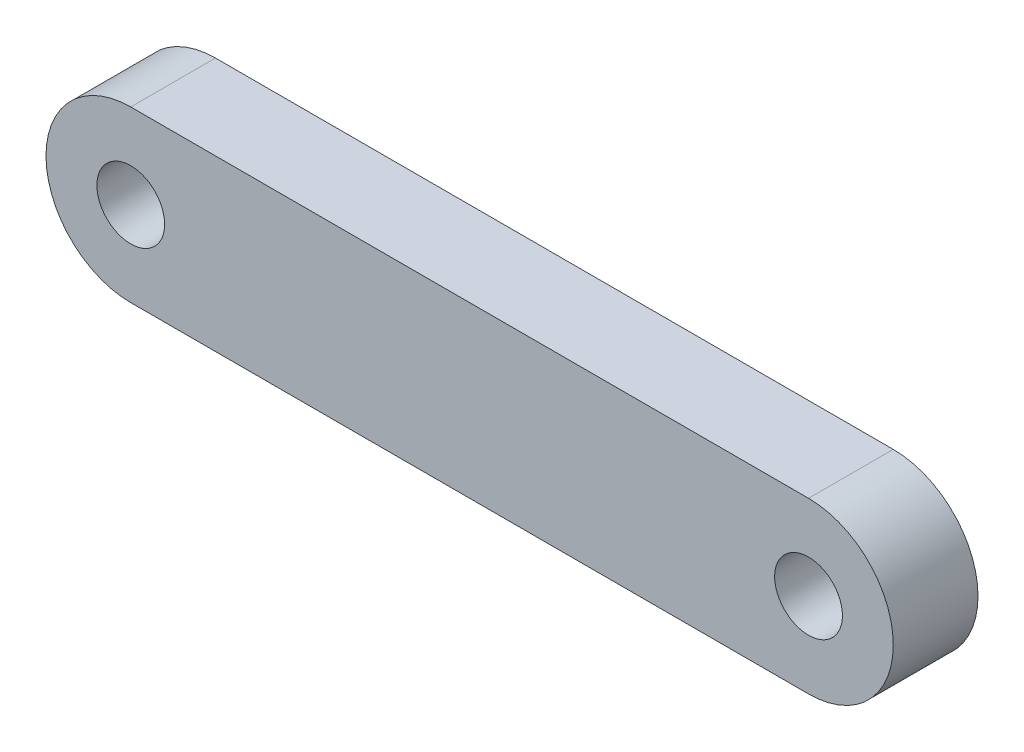
ISO-10303-21;
HEADER;
FILE_DESCRIPTION(('STEP AP214'),'2;1');
FILE_NAME('part.step','',(''),(''),'','','');
FILE_SCHEMA(('AUTOMOTIVE_DESIGN { 1 0 10303 214 1 1 1 1 }'));
ENDSEC;
DATA;
#1=APPLICATION_CONTEXT('core data for automotive mechanical design processes');
#2=APPLICATION_PROTOCOL_DEFINITION('international standard','automotive_design',2000,#1);
#3=PRODUCT_CONTEXT('',#1,'mechanical');
#4=PRODUCT('Part','Part','',(#3));
#5=PRODUCT_RELATED_PRODUCT_CATEGORY('part','',(#4));
#6=PRODUCT_DEFINITION_FORMATION('','',#4);
#7=PRODUCT_DEFINITION_CONTEXT('part definition',#1,'design');
#8=PRODUCT_DEFINITION('design','',#6,#7);
#9=PRODUCT_DEFINITION_SHAPE('','',#8);
#10=(LENGTH_UNIT() NAMED_UNIT(*) SI_UNIT(.MILLI.,.METRE.));
#11=(NAMED_UNIT(*) PLANE_ANGLE_UNIT() SI_UNIT($,.RADIAN.));
#12=(NAMED_UNIT(*) SI_UNIT($,.STERADIAN.) SOLID_ANGLE_UNIT());
#13=UNCERTAINTY_MEASURE_WITH_UNIT(LENGTH_MEASURE(1.E-05),#10,'distance_accuracy_value','');
#14=(GEOMETRIC_REPRESENTATION_CONTEXT(3) GLOBAL_UNCERTAINTY_ASSIGNED_CONTEXT((#13)) GLOBAL_UNIT_ASSIGNED_CONTEXT((#10,
#11,#12)) REPRESENTATION_CONTEXT('',''));
#15=CARTESIAN_POINT('',(0.,0.,0.));
#16=DIRECTION('',(0.,0.,1.));
#17=DIRECTION('',(1.,0.,0.));
#18=AXIS2_PLACEMENT_3D('',#15,#16,#17);
#19=CARTESIAN_POINT('',(-20.,0.,-5.));
#20=DIRECTION('',(0.,0.,-1.));
#21=DIRECTION('',(1.,0.,0.));
#22=AXIS2_PLACEMENT_3D('',#19,#20,#21);
#23=PLANE('',#22);
#24=CARTESIAN_POINT('',(-20.,0.,-5.));
#25=DIRECTION('',(0.,0.,1.));
#26=DIRECTION('',(1.,0.,0.));
#27=AXIS2_PLACEMENT_3D('',#24,#25,#26);
#28=CIRCLE('',#27,2.);
#29=CARTESIAN_POINT('',(-18.,0.,-5.));
#30=VERTEX_POINT('',#29);
#31=EDGE_CURVE('E103',#30,#30,#28,.T.);
#32=ORIENTED_EDGE('',*,*,#31,.T.);
#33=EDGE_LOOP('',(#32));
#34=FACE_BOUND('',#33,.T.);
#35=CARTESIAN_POINT('',(-20.,0.,-5.));
#36=DIRECTION('',(0.,0.,1.));
#37=DIRECTION('',(1.,0.,0.));
#38=AXIS2_PLACEMENT_3D('',#35,#36,#37);
#39=CIRCLE('',#38,5.);
#40=CARTESIAN_POINT('',(-20.,5.,-5.));
#41=VERTEX_POINT('',#40);
#42=CARTESIAN_POINT('',(-20.,-5.,-5.));
#43=VERTEX_POINT('',#42);
#44=EDGE_CURVE('E91',#41,#43,#39,.T.);
#45=ORIENTED_EDGE('',*,*,#44,.F.);
#46=DIRECTION('',(-1.,0.,0.));
#47=VECTOR('',#46,1.);
#48=CARTESIAN_POINT('',(-20.,5.,-5.));
#49=LINE('',#48,#47);
#50=CARTESIAN_POINT('',(20.,5.00000000000001,-5.));
#51=VERTEX_POINT('',#50);
#52=EDGE_CURVE('E94',#51,#41,#49,.T.);
#53=ORIENTED_EDGE('',*,*,#52,.F.);
#54=CARTESIAN_POINT('',(20.,0.,-5.));
#55=DIRECTION('',(0.,0.,1.));
#56=DIRECTION('',(1.,0.,0.));
#57=AXIS2_PLACEMENT_3D('',#54,#55,#56);
#58=CIRCLE('',#57,5.);
#59=CARTESIAN_POINT('',(20.,-5.,-5.));
#60=VERTEX_POINT('',#59);
#61=EDGE_CURVE('E82',#60,#51,#58,.T.);
#62=ORIENTED_EDGE('',*,*,#61,.F.);
#63=DIRECTION('',(1.,0.,0.));
#64=VECTOR('',#63,1.);
#65=CARTESIAN_POINT('',(-20.,-5.,-5.));
#66=LINE('',#65,#64);
#67=EDGE_CURVE('E87',#43,#60,#66,.T.);
#68=ORIENTED_EDGE('',*,*,#67,.F.);
#69=EDGE_LOOP('',(#45,#53,#62,#68));
#70=FACE_BOUND('',#69,.T.);
#71=CARTESIAN_POINT('',(20.,0.,-5.));
#72=DIRECTION('',(0.,0.,1.));
#73=DIRECTION('',(1.,0.,0.));
#74=AXIS2_PLACEMENT_3D('',#71,#72,#73);
#75=CIRCLE('',#74,2.);
#76=CARTESIAN_POINT('',(22.,0.,-5.));
#77=VERTEX_POINT('',#76);
#78=EDGE_CURVE('E114',#77,#77,#75,.T.);
#79=ORIENTED_EDGE('',*,*,#78,.T.);
#80=EDGE_LOOP('',(#79));
#81=FACE_BOUND('',#80,.T.);
#82=ADVANCED_FACE('F35',(#34,#70,#81),#23,.T.);
#83=CARTESIAN_POINT('',(-20.,0.,0.));
#84=DIRECTION('',(0.,0.,-1.));
#85=DIRECTION('',(1.,0.,0.));
#86=AXIS2_PLACEMENT_3D('',#83,#84,#85);
#87=PLANE('',#86);
#88=CARTESIAN_POINT('',(-20.,0.,0.));
#89=DIRECTION('',(0.,0.,1.));
#90=DIRECTION('',(1.,0.,0.));
#91=AXIS2_PLACEMENT_3D('',#88,#89,#90);
#92=CIRCLE('',#91,5.);
#93=CARTESIAN_POINT('',(-20.,5.,0.));
#94=VERTEX_POINT('',#93);
#95=CARTESIAN_POINT('',(-20.,-5.,0.));
#96=VERTEX_POINT('',#95);
#97=EDGE_CURVE('E99',#94,#96,#92,.T.);
#98=ORIENTED_EDGE('',*,*,#97,.T.);
#99=DIRECTION('',(1.,0.,0.));
#100=VECTOR('',#99,1.);
#101=CARTESIAN_POINT('',(-20.,-5.,0.));
#102=LINE('',#101,#100);
#103=CARTESIAN_POINT('',(20.,-5.,0.));
#104=VERTEX_POINT('',#103);
#105=EDGE_CURVE('E102',#96,#104,#102,.T.);
#106=ORIENTED_EDGE('',*,*,#105,.T.);
#107=CARTESIAN_POINT('',(20.,0.,0.));
#108=DIRECTION('',(0.,0.,1.));
#109=DIRECTION('',(1.,0.,0.));
#110=AXIS2_PLACEMENT_3D('',#107,#108,#109);
#111=CIRCLE('',#110,5.);
#112=CARTESIAN_POINT('',(20.,5.00000000000001,0.));
#113=VERTEX_POINT('',#112);
#114=EDGE_CURVE('E85',#104,#113,#111,.T.);
#115=ORIENTED_EDGE('',*,*,#114,.T.);
#116=DIRECTION('',(-1.,0.,0.));
#117=VECTOR('',#116,1.);
#118=CARTESIAN_POINT('',(-20.,5.,0.));
#119=LINE('',#118,#117);
#120=EDGE_CURVE('E106',#113,#94,#119,.T.);
#121=ORIENTED_EDGE('',*,*,#120,.T.);
#122=EDGE_LOOP('',(#98,#106,#115,#121));
#123=FACE_BOUND('',#122,.T.);
#124=CARTESIAN_POINT('',(-20.,0.,0.));
#125=DIRECTION('',(0.,0.,1.));
#126=DIRECTION('',(1.,0.,0.));
#127=AXIS2_PLACEMENT_3D('',#124,#125,#126);
#128=CIRCLE('',#127,2.);
#129=CARTESIAN_POINT('',(-18.,0.,0.));
#130=VERTEX_POINT('',#129);
#131=EDGE_CURVE('E111',#130,#130,#128,.T.);
#132=ORIENTED_EDGE('',*,*,#131,.F.);
#133=EDGE_LOOP('',(#132));
#134=FACE_BOUND('',#133,.T.);
#135=CARTESIAN_POINT('',(20.,0.,0.));
#136=DIRECTION('',(0.,0.,1.));
#137=DIRECTION('',(1.,0.,0.));
#138=AXIS2_PLACEMENT_3D('',#135,#136,#137);
#139=CIRCLE('',#138,2.);
#140=CARTESIAN_POINT('',(22.,0.,0.));
#141=VERTEX_POINT('',#140);
#142=EDGE_CURVE('E117',#141,#141,#139,.T.);
#143=ORIENTED_EDGE('',*,*,#142,.F.);
#144=EDGE_LOOP('',(#143));
#145=FACE_BOUND('',#144,.T.);
#146=ADVANCED_FACE('F130',(#123,#134,#145),#87,.F.);
#147=CARTESIAN_POINT('',(-20.,0.,-5.));
#148=DIRECTION('',(0.,0.,1.));
#149=DIRECTION('',(-1.,0.,0.));
#150=AXIS2_PLACEMENT_3D('',#147,#148,#149);
#151=CYLINDRICAL_SURFACE('',#150,5.);
#152=ORIENTED_EDGE('',*,*,#97,.F.);
#153=DIRECTION('',(0.,0.,1.));
#154=VECTOR('',#153,1.);
#155=CARTESIAN_POINT('',(-20.,5.,-5.));
#156=LINE('',#155,#154);
#157=EDGE_CURVE('E52',#41,#94,#156,.T.);
#158=ORIENTED_EDGE('',*,*,#157,.F.);
#159=ORIENTED_EDGE('',*,*,#44,.T.);
#160=DIRECTION('',(0.,0.,1.));
#161=VECTOR('',#160,1.);
#162=CARTESIAN_POINT('',(-20.,-5.,-5.));
#163=LINE('',#162,#161);
#164=EDGE_CURVE('E11',#43,#96,#163,.T.);
#165=ORIENTED_EDGE('',*,*,#164,.T.);
#166=EDGE_LOOP('',(#152,#158,#159,#165));
#167=FACE_BOUND('',#166,.T.);
#168=ADVANCED_FACE('F37',(#167),#151,.T.);
#169=CARTESIAN_POINT('',(-20.,-5.,-5.));
#170=DIRECTION('',(0.,1.,0.));
#171=DIRECTION('',(-1.,0.,0.));
#172=AXIS2_PLACEMENT_3D('',#169,#170,#171);
#173=PLANE('',#172);
#174=ORIENTED_EDGE('',*,*,#105,.F.);
#175=ORIENTED_EDGE('',*,*,#164,.F.);
#176=ORIENTED_EDGE('',*,*,#67,.T.);
#177=DIRECTION('',(0.,0.,1.));
#178=VECTOR('',#177,1.);
#179=CARTESIAN_POINT('',(20.,-5.,-5.));
#180=LINE('',#179,#178);
#181=EDGE_CURVE('E44',#60,#104,#180,.T.);
#182=ORIENTED_EDGE('',*,*,#181,.T.);
#183=EDGE_LOOP('',(#174,#175,#176,#182));
#184=FACE_BOUND('',#183,.T.);
#185=ADVANCED_FACE('F88',(#184),#173,.F.);
#186=CARTESIAN_POINT('',(20.,0.,-5.));
#187=DIRECTION('',(0.,0.,1.));
#188=DIRECTION('',(-1.,0.,0.));
#189=AXIS2_PLACEMENT_3D('',#186,#187,#188);
#190=CYLINDRICAL_SURFACE('',#189,5.);
#191=ORIENTED_EDGE('',*,*,#114,.F.);
#192=ORIENTED_EDGE('',*,*,#181,.F.);
#193=ORIENTED_EDGE('',*,*,#61,.T.);
#194=DIRECTION('',(0.,0.,1.));
#195=VECTOR('',#194,1.);
#196=CARTESIAN_POINT('',(20.,5.00000000000001,-5.));
#197=LINE('',#196,#195);
#198=EDGE_CURVE('E68',#51,#113,#197,.T.);
#199=ORIENTED_EDGE('',*,*,#198,.T.);
#200=EDGE_LOOP('',(#191,#192,#193,#199));
#201=FACE_BOUND('',#200,.T.);
#202=ADVANCED_FACE('F80',(#201),#190,.T.);
#203=CARTESIAN_POINT('',(-20.,5.,-5.));
#204=DIRECTION('',(0.,-1.,0.));
#205=DIRECTION('',(1.,0.,0.));
#206=AXIS2_PLACEMENT_3D('',#203,#204,#205);
#207=PLANE('',#206);
#208=ORIENTED_EDGE('',*,*,#120,.F.);
#209=ORIENTED_EDGE('',*,*,#198,.F.);
#210=ORIENTED_EDGE('',*,*,#52,.T.);
#211=ORIENTED_EDGE('',*,*,#157,.T.);
#212=EDGE_LOOP('',(#208,#209,#210,#211));
#213=FACE_BOUND('',#212,.T.);
#214=ADVANCED_FACE('F142',(#213),#207,.F.);
#215=CARTESIAN_POINT('',(-20.,0.,-5.));
#216=DIRECTION('',(0.,0.,1.));
#217=DIRECTION('',(-1.,0.,0.));
#218=AXIS2_PLACEMENT_3D('',#215,#216,#217);
#219=CYLINDRICAL_SURFACE('',#218,2.);
#220=ORIENTED_EDGE('',*,*,#31,.F.);
#221=EDGE_LOOP('',(#220));
#222=FACE_BOUND('',#221,.T.);
#223=ORIENTED_EDGE('',*,*,#131,.T.);
#224=EDGE_LOOP('',(#223));
#225=FACE_BOUND('',#224,.T.);
#226=ADVANCED_FACE('F126',(#222,#225),#219,.F.);
#227=CARTESIAN_POINT('',(20.,0.,-5.));
#228=DIRECTION('',(0.,0.,1.));
#229=DIRECTION('',(-1.,0.,0.));
#230=AXIS2_PLACEMENT_3D('',#227,#228,#229);
#231=CYLINDRICAL_SURFACE('',#230,2.);
#232=ORIENTED_EDGE('',*,*,#78,.F.);
#233=EDGE_LOOP('',(#232));
#234=FACE_BOUND('',#233,.T.);
#235=ORIENTED_EDGE('',*,*,#142,.T.);
#236=EDGE_LOOP('',(#235));
#237=FACE_BOUND('',#236,.T.);
#238=ADVANCED_FACE('F123',(#234,#237),#231,.F.);
#239=CLOSED_SHELL('',(#82,#146,#168,#185,#202,#214,#226,#238));
#240=MANIFOLD_SOLID_BREP('B2',#239);
#241=ADVANCED_BREP_SHAPE_REPRESENTATION('',(#18,#240),#14);
#242=SHAPE_DEFINITION_REPRESENTATION(#9,#241);
ENDSEC;
END-ISO-10303-21;
